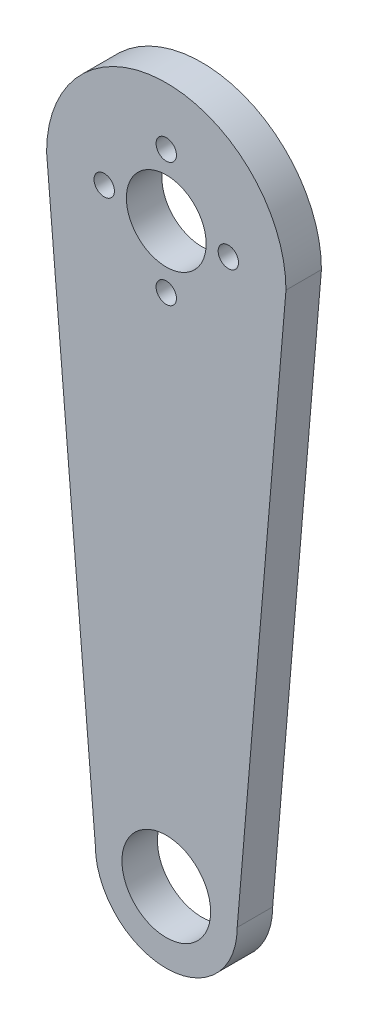
ISO-10303-21;
HEADER;
FILE_DESCRIPTION(('STEP AP214'),'2;1');
FILE_NAME('part.step','',(''),(''),'','','');
FILE_SCHEMA(('AUTOMOTIVE_DESIGN { 1 0 10303 214 1 1 1 1 }'));
ENDSEC;
DATA;
#1=APPLICATION_CONTEXT('core data for automotive mechanical design processes');
#2=APPLICATION_PROTOCOL_DEFINITION('international standard','automotive_design',2000,#1);
#3=PRODUCT_CONTEXT('',#1,'mechanical');
#4=PRODUCT('Part','Part','',(#3));
#5=PRODUCT_RELATED_PRODUCT_CATEGORY('part','',(#4));
#6=PRODUCT_DEFINITION_FORMATION('','',#4);
#7=PRODUCT_DEFINITION_CONTEXT('part definition',#1,'design');
#8=PRODUCT_DEFINITION('design','',#6,#7);
#9=PRODUCT_DEFINITION_SHAPE('','',#8);
#10=(LENGTH_UNIT() NAMED_UNIT(*) SI_UNIT(.MILLI.,.METRE.));
#11=(NAMED_UNIT(*) PLANE_ANGLE_UNIT() SI_UNIT($,.RADIAN.));
#12=(NAMED_UNIT(*) SI_UNIT($,.STERADIAN.) SOLID_ANGLE_UNIT());
#13=UNCERTAINTY_MEASURE_WITH_UNIT(LENGTH_MEASURE(1.E-05),#10,'distance_accuracy_value','');
#14=(GEOMETRIC_REPRESENTATION_CONTEXT(3) GLOBAL_UNCERTAINTY_ASSIGNED_CONTEXT((#13)) GLOBAL_UNIT_ASSIGNED_CONTEXT((#10,
#11,#12)) REPRESENTATION_CONTEXT('',''));
#15=CARTESIAN_POINT('',(0.,0.,0.));
#16=DIRECTION('',(0.,0.,1.));
#17=DIRECTION('',(1.,0.,0.));
#18=AXIS2_PLACEMENT_3D('',#15,#16,#17);
#19=CARTESIAN_POINT('',(0.,0.,4.));
#20=DIRECTION('',(0.,0.,1.));
#21=DIRECTION('',(1.,0.,0.));
#22=AXIS2_PLACEMENT_3D('',#19,#20,#21);
#23=PLANE('',#22);
#24=CARTESIAN_POINT('',(-7.,0.,4.));
#25=DIRECTION('',(0.,0.,1.));
#26=DIRECTION('',(1.,0.,0.));
#27=AXIS2_PLACEMENT_3D('',#24,#25,#26);
#28=CIRCLE('',#27,1.15);
#29=CARTESIAN_POINT('',(-5.85,0.,4.));
#30=VERTEX_POINT('',#29);
#31=EDGE_CURVE('E181',#30,#30,#28,.T.);
#32=ORIENTED_EDGE('',*,*,#31,.F.);
#33=EDGE_LOOP('',(#32));
#34=FACE_BOUND('',#33,.T.);
#35=CARTESIAN_POINT('',(7.,0.,4.));
#36=DIRECTION('',(0.,0.,1.));
#37=DIRECTION('',(1.,0.,0.));
#38=AXIS2_PLACEMENT_3D('',#35,#36,#37);
#39=CIRCLE('',#38,1.15);
#40=CARTESIAN_POINT('',(8.15,0.,4.));
#41=VERTEX_POINT('',#40);
#42=EDGE_CURVE('E138',#41,#41,#39,.T.);
#43=ORIENTED_EDGE('',*,*,#42,.F.);
#44=EDGE_LOOP('',(#43));
#45=FACE_BOUND('',#44,.T.);
#46=CARTESIAN_POINT('',(0.,0.,4.));
#47=DIRECTION('',(0.,0.,1.));
#48=DIRECTION('',(1.,0.,0.));
#49=AXIS2_PLACEMENT_3D('',#46,#47,#48);
#50=CIRCLE('',#49,4.5);
#51=CARTESIAN_POINT('',(4.5,0.,4.));
#52=VERTEX_POINT('',#51);
#53=EDGE_CURVE('E139',#52,#52,#50,.T.);
#54=ORIENTED_EDGE('',*,*,#53,.F.);
#55=EDGE_LOOP('',(#54));
#56=FACE_BOUND('',#55,.T.);
#57=CARTESIAN_POINT('',(0.,0.,4.));
#58=DIRECTION('',(0.,0.,1.));
#59=DIRECTION('',(1.,0.,0.));
#60=AXIS2_PLACEMENT_3D('',#57,#58,#59);
#61=CIRCLE('',#60,13.5);
#62=CARTESIAN_POINT('',(13.5,0.,4.));
#63=VERTEX_POINT('',#62);
#64=CARTESIAN_POINT('',(-13.5,0.,4.));
#65=VERTEX_POINT('',#64);
#66=EDGE_CURVE('E99',#63,#65,#61,.T.);
#67=ORIENTED_EDGE('',*,*,#66,.T.);
#68=DIRECTION('',(0.0843140884969095,-0.996439227690749,0.));
#69=VECTOR('',#68,1.);
#70=CARTESIAN_POINT('',(-13.5,0.,4.));
#71=LINE('',#70,#69);
#72=CARTESIAN_POINT('',(-8.,-65.,4.));
#73=VERTEX_POINT('',#72);
#74=EDGE_CURVE('E94',#65,#73,#71,.T.);
#75=ORIENTED_EDGE('',*,*,#74,.T.);
#76=CARTESIAN_POINT('',(0.,-65.,4.));
#77=DIRECTION('',(0.,0.,1.));
#78=DIRECTION('',(1.,0.,0.));
#79=AXIS2_PLACEMENT_3D('',#76,#77,#78);
#80=CIRCLE('',#79,8.);
#81=CARTESIAN_POINT('',(8.,-65.,4.));
#82=VERTEX_POINT('',#81);
#83=EDGE_CURVE('E97',#73,#82,#80,.T.);
#84=ORIENTED_EDGE('',*,*,#83,.T.);
#85=DIRECTION('',(0.0843140884969095,0.996439227690749,0.));
#86=VECTOR('',#85,1.);
#87=CARTESIAN_POINT('',(8.,-65.,4.));
#88=LINE('',#87,#86);
#89=EDGE_CURVE('E64',#82,#63,#88,.T.);
#90=ORIENTED_EDGE('',*,*,#89,.T.);
#91=EDGE_LOOP('',(#67,#75,#84,#90));
#92=FACE_BOUND('',#91,.T.);
#93=CARTESIAN_POINT('',(0.,7.,4.));
#94=DIRECTION('',(0.,0.,1.));
#95=DIRECTION('',(1.,0.,0.));
#96=AXIS2_PLACEMENT_3D('',#93,#94,#95);
#97=CIRCLE('',#96,1.15);
#98=CARTESIAN_POINT('',(1.15,7.,4.));
#99=VERTEX_POINT('',#98);
#100=EDGE_CURVE('E125',#99,#99,#97,.T.);
#101=ORIENTED_EDGE('',*,*,#100,.F.);
#102=EDGE_LOOP('',(#101));
#103=FACE_BOUND('',#102,.T.);
#104=CARTESIAN_POINT('',(0.,-7.,4.));
#105=DIRECTION('',(0.,0.,1.));
#106=DIRECTION('',(1.,0.,0.));
#107=AXIS2_PLACEMENT_3D('',#104,#105,#106);
#108=CIRCLE('',#107,1.15);
#109=CARTESIAN_POINT('',(1.15,-7.,4.));
#110=VERTEX_POINT('',#109);
#111=EDGE_CURVE('E175',#110,#110,#108,.T.);
#112=ORIENTED_EDGE('',*,*,#111,.F.);
#113=EDGE_LOOP('',(#112));
#114=FACE_BOUND('',#113,.T.);
#115=CARTESIAN_POINT('',(0.,-65.,4.));
#116=DIRECTION('',(0.,0.,1.));
#117=DIRECTION('',(1.,0.,0.));
#118=AXIS2_PLACEMENT_3D('',#115,#116,#117);
#119=CIRCLE('',#118,5.);
#120=CARTESIAN_POINT('',(5.,-65.,4.));
#121=VERTEX_POINT('',#120);
#122=EDGE_CURVE('E189',#121,#121,#119,.T.);
#123=ORIENTED_EDGE('',*,*,#122,.F.);
#124=EDGE_LOOP('',(#123));
#125=FACE_BOUND('',#124,.T.);
#126=ADVANCED_FACE('F46',(#34,#45,#56,#92,#103,#114,#125),#23,.T.);
#127=CARTESIAN_POINT('',(0.,0.,0.));
#128=DIRECTION('',(0.,0.,1.));
#129=DIRECTION('',(1.,0.,0.));
#130=AXIS2_PLACEMENT_3D('',#127,#128,#129);
#131=PLANE('',#130);
#132=CARTESIAN_POINT('',(0.,0.,0.));
#133=DIRECTION('',(0.,0.,1.));
#134=DIRECTION('',(1.,0.,0.));
#135=AXIS2_PLACEMENT_3D('',#132,#133,#134);
#136=CIRCLE('',#135,13.5);
#137=CARTESIAN_POINT('',(13.5,0.,0.));
#138=VERTEX_POINT('',#137);
#139=CARTESIAN_POINT('',(-13.5,0.,0.));
#140=VERTEX_POINT('',#139);
#141=EDGE_CURVE('E144',#138,#140,#136,.T.);
#142=ORIENTED_EDGE('',*,*,#141,.F.);
#143=DIRECTION('',(0.0843140884969095,0.996439227690749,0.));
#144=VECTOR('',#143,1.);
#145=CARTESIAN_POINT('',(8.,-65.,0.));
#146=LINE('',#145,#144);
#147=CARTESIAN_POINT('',(8.,-65.,0.));
#148=VERTEX_POINT('',#147);
#149=EDGE_CURVE('E87',#148,#138,#146,.T.);
#150=ORIENTED_EDGE('',*,*,#149,.F.);
#151=CARTESIAN_POINT('',(0.,-65.,0.));
#152=DIRECTION('',(0.,0.,1.));
#153=DIRECTION('',(1.,0.,0.));
#154=AXIS2_PLACEMENT_3D('',#151,#152,#153);
#155=CIRCLE('',#154,8.);
#156=CARTESIAN_POINT('',(-8.,-65.,0.));
#157=VERTEX_POINT('',#156);
#158=EDGE_CURVE('E81',#157,#148,#155,.T.);
#159=ORIENTED_EDGE('',*,*,#158,.F.);
#160=DIRECTION('',(0.0843140884969095,-0.996439227690749,0.));
#161=VECTOR('',#160,1.);
#162=CARTESIAN_POINT('',(-13.5,0.,0.));
#163=LINE('',#162,#161);
#164=EDGE_CURVE('E104',#140,#157,#163,.T.);
#165=ORIENTED_EDGE('',*,*,#164,.F.);
#166=EDGE_LOOP('',(#142,#150,#159,#165));
#167=FACE_BOUND('',#166,.T.);
#168=CARTESIAN_POINT('',(0.,0.,0.));
#169=DIRECTION('',(0.,0.,1.));
#170=DIRECTION('',(1.,0.,0.));
#171=AXIS2_PLACEMENT_3D('',#168,#169,#170);
#172=CIRCLE('',#171,4.5);
#173=CARTESIAN_POINT('',(4.5,0.,0.));
#174=VERTEX_POINT('',#173);
#175=EDGE_CURVE('E131',#174,#174,#172,.T.);
#176=ORIENTED_EDGE('',*,*,#175,.T.);
#177=EDGE_LOOP('',(#176));
#178=FACE_BOUND('',#177,.T.);
#179=CARTESIAN_POINT('',(0.,7.,0.));
#180=DIRECTION('',(0.,0.,1.));
#181=DIRECTION('',(1.,0.,0.));
#182=AXIS2_PLACEMENT_3D('',#179,#180,#181);
#183=CIRCLE('',#182,1.15);
#184=CARTESIAN_POINT('',(1.15,7.,0.));
#185=VERTEX_POINT('',#184);
#186=EDGE_CURVE('E132',#185,#185,#183,.T.);
#187=ORIENTED_EDGE('',*,*,#186,.T.);
#188=EDGE_LOOP('',(#187));
#189=FACE_BOUND('',#188,.T.);
#190=CARTESIAN_POINT('',(7.,0.,0.));
#191=DIRECTION('',(0.,0.,1.));
#192=DIRECTION('',(1.,0.,0.));
#193=AXIS2_PLACEMENT_3D('',#190,#191,#192);
#194=CIRCLE('',#193,1.15);
#195=CARTESIAN_POINT('',(8.15,0.,0.));
#196=VERTEX_POINT('',#195);
#197=EDGE_CURVE('E133',#196,#196,#194,.T.);
#198=ORIENTED_EDGE('',*,*,#197,.T.);
#199=EDGE_LOOP('',(#198));
#200=FACE_BOUND('',#199,.T.);
#201=CARTESIAN_POINT('',(0.,-7.,0.));
#202=DIRECTION('',(0.,0.,1.));
#203=DIRECTION('',(1.,0.,0.));
#204=AXIS2_PLACEMENT_3D('',#201,#202,#203);
#205=CIRCLE('',#204,1.15);
#206=CARTESIAN_POINT('',(1.15,-7.,0.));
#207=VERTEX_POINT('',#206);
#208=EDGE_CURVE('E178',#207,#207,#205,.T.);
#209=ORIENTED_EDGE('',*,*,#208,.T.);
#210=EDGE_LOOP('',(#209));
#211=FACE_BOUND('',#210,.T.);
#212=CARTESIAN_POINT('',(-7.,0.,0.));
#213=DIRECTION('',(0.,0.,1.));
#214=DIRECTION('',(1.,0.,0.));
#215=AXIS2_PLACEMENT_3D('',#212,#213,#214);
#216=CIRCLE('',#215,1.15);
#217=CARTESIAN_POINT('',(-5.85,0.,0.));
#218=VERTEX_POINT('',#217);
#219=EDGE_CURVE('E185',#218,#218,#216,.T.);
#220=ORIENTED_EDGE('',*,*,#219,.T.);
#221=EDGE_LOOP('',(#220));
#222=FACE_BOUND('',#221,.T.);
#223=CARTESIAN_POINT('',(0.,-65.,0.));
#224=DIRECTION('',(0.,0.,1.));
#225=DIRECTION('',(1.,0.,0.));
#226=AXIS2_PLACEMENT_3D('',#223,#224,#225);
#227=CIRCLE('',#226,5.);
#228=CARTESIAN_POINT('',(5.,-65.,0.));
#229=VERTEX_POINT('',#228);
#230=EDGE_CURVE('E193',#229,#229,#227,.T.);
#231=ORIENTED_EDGE('',*,*,#230,.T.);
#232=EDGE_LOOP('',(#231));
#233=FACE_BOUND('',#232,.T.);
#234=ADVANCED_FACE('F162',(#167,#178,#189,#200,#211,#222,#233),#131,.F.);
#235=CARTESIAN_POINT('',(0.,0.,4.));
#236=DIRECTION('',(0.,0.,-1.));
#237=DIRECTION('',(-1.,0.,0.));
#238=AXIS2_PLACEMENT_3D('',#235,#236,#237);
#239=CYLINDRICAL_SURFACE('',#238,13.5);
#240=ORIENTED_EDGE('',*,*,#141,.T.);
#241=DIRECTION('',(0.,0.,-1.));
#242=VECTOR('',#241,1.);
#243=CARTESIAN_POINT('',(-13.5,0.,4.));
#244=LINE('',#243,#242);
#245=EDGE_CURVE('E12',#65,#140,#244,.T.);
#246=ORIENTED_EDGE('',*,*,#245,.F.);
#247=ORIENTED_EDGE('',*,*,#66,.F.);
#248=DIRECTION('',(0.,0.,-1.));
#249=VECTOR('',#248,1.);
#250=CARTESIAN_POINT('',(13.5,0.,4.));
#251=LINE('',#250,#249);
#252=EDGE_CURVE('E111',#63,#138,#251,.T.);
#253=ORIENTED_EDGE('',*,*,#252,.T.);
#254=EDGE_LOOP('',(#240,#246,#247,#253));
#255=FACE_BOUND('',#254,.T.);
#256=ADVANCED_FACE('F48',(#255),#239,.T.);
#257=CARTESIAN_POINT('',(-13.5,0.,4.));
#258=DIRECTION('',(0.996439227690748,0.0843140884969095,0.));
#259=DIRECTION('',(-0.0843140884969095,0.996439227690749,0.));
#260=AXIS2_PLACEMENT_3D('',#257,#258,#259);
#261=PLANE('',#260);
#262=ORIENTED_EDGE('',*,*,#164,.T.);
#263=DIRECTION('',(0.,0.,-1.));
#264=VECTOR('',#263,1.);
#265=CARTESIAN_POINT('',(-8.,-65.,4.));
#266=LINE('',#265,#264);
#267=EDGE_CURVE('E56',#73,#157,#266,.T.);
#268=ORIENTED_EDGE('',*,*,#267,.F.);
#269=ORIENTED_EDGE('',*,*,#74,.F.);
#270=ORIENTED_EDGE('',*,*,#245,.T.);
#271=EDGE_LOOP('',(#262,#268,#269,#270));
#272=FACE_BOUND('',#271,.T.);
#273=ADVANCED_FACE('F103',(#272),#261,.F.);
#274=CARTESIAN_POINT('',(0.,-65.,4.));
#275=DIRECTION('',(0.,0.,-1.));
#276=DIRECTION('',(-1.,0.,0.));
#277=AXIS2_PLACEMENT_3D('',#274,#275,#276);
#278=CYLINDRICAL_SURFACE('',#277,8.);
#279=ORIENTED_EDGE('',*,*,#158,.T.);
#280=DIRECTION('',(0.,0.,-1.));
#281=VECTOR('',#280,1.);
#282=CARTESIAN_POINT('',(8.,-65.,4.));
#283=LINE('',#282,#281);
#284=EDGE_CURVE('E106',#82,#148,#283,.T.);
#285=ORIENTED_EDGE('',*,*,#284,.F.);
#286=ORIENTED_EDGE('',*,*,#83,.F.);
#287=ORIENTED_EDGE('',*,*,#267,.T.);
#288=EDGE_LOOP('',(#279,#285,#286,#287));
#289=FACE_BOUND('',#288,.T.);
#290=ADVANCED_FACE('F107',(#289),#278,.T.);
#291=CARTESIAN_POINT('',(8.,-65.,4.));
#292=DIRECTION('',(-0.996439227690748,0.0843140884969095,0.));
#293=DIRECTION('',(-0.0843140884969095,-0.996439227690749,0.));
#294=AXIS2_PLACEMENT_3D('',#291,#292,#293);
#295=PLANE('',#294);
#296=ORIENTED_EDGE('',*,*,#149,.T.);
#297=ORIENTED_EDGE('',*,*,#252,.F.);
#298=ORIENTED_EDGE('',*,*,#89,.F.);
#299=ORIENTED_EDGE('',*,*,#284,.T.);
#300=EDGE_LOOP('',(#296,#297,#298,#299));
#301=FACE_BOUND('',#300,.T.);
#302=ADVANCED_FACE('F159',(#301),#295,.F.);
#303=CARTESIAN_POINT('',(0.,0.,4.));
#304=DIRECTION('',(0.,0.,-1.));
#305=DIRECTION('',(-1.,0.,0.));
#306=AXIS2_PLACEMENT_3D('',#303,#304,#305);
#307=CYLINDRICAL_SURFACE('',#306,4.5);
#308=ORIENTED_EDGE('',*,*,#53,.T.);
#309=EDGE_LOOP('',(#308));
#310=FACE_BOUND('',#309,.T.);
#311=ORIENTED_EDGE('',*,*,#175,.F.);
#312=EDGE_LOOP('',(#311));
#313=FACE_BOUND('',#312,.T.);
#314=ADVANCED_FACE('F224',(#310,#313),#307,.F.);
#315=CARTESIAN_POINT('',(0.,7.,4.));
#316=DIRECTION('',(0.,0.,-1.));
#317=DIRECTION('',(-1.,0.,0.));
#318=AXIS2_PLACEMENT_3D('',#315,#316,#317);
#319=CYLINDRICAL_SURFACE('',#318,1.15);
#320=ORIENTED_EDGE('',*,*,#100,.T.);
#321=EDGE_LOOP('',(#320));
#322=FACE_BOUND('',#321,.T.);
#323=ORIENTED_EDGE('',*,*,#186,.F.);
#324=EDGE_LOOP('',(#323));
#325=FACE_BOUND('',#324,.T.);
#326=ADVANCED_FACE('F269',(#322,#325),#319,.F.);
#327=CARTESIAN_POINT('',(7.,0.,4.));
#328=DIRECTION('',(0.,0.,-1.));
#329=DIRECTION('',(-1.,0.,0.));
#330=AXIS2_PLACEMENT_3D('',#327,#328,#329);
#331=CYLINDRICAL_SURFACE('',#330,1.15);
#332=ORIENTED_EDGE('',*,*,#42,.T.);
#333=EDGE_LOOP('',(#332));
#334=FACE_BOUND('',#333,.T.);
#335=ORIENTED_EDGE('',*,*,#197,.F.);
#336=EDGE_LOOP('',(#335));
#337=FACE_BOUND('',#336,.T.);
#338=ADVANCED_FACE('F277',(#334,#337),#331,.F.);
#339=CARTESIAN_POINT('',(0.,-7.,4.));
#340=DIRECTION('',(0.,0.,-1.));
#341=DIRECTION('',(-1.,0.,0.));
#342=AXIS2_PLACEMENT_3D('',#339,#340,#341);
#343=CYLINDRICAL_SURFACE('',#342,1.15);
#344=ORIENTED_EDGE('',*,*,#111,.T.);
#345=EDGE_LOOP('',(#344));
#346=FACE_BOUND('',#345,.T.);
#347=ORIENTED_EDGE('',*,*,#208,.F.);
#348=EDGE_LOOP('',(#347));
#349=FACE_BOUND('',#348,.T.);
#350=ADVANCED_FACE('F211',(#346,#349),#343,.F.);
#351=CARTESIAN_POINT('',(-7.,0.,4.));
#352=DIRECTION('',(0.,0.,-1.));
#353=DIRECTION('',(-1.,0.,0.));
#354=AXIS2_PLACEMENT_3D('',#351,#352,#353);
#355=CYLINDRICAL_SURFACE('',#354,1.15);
#356=ORIENTED_EDGE('',*,*,#31,.T.);
#357=EDGE_LOOP('',(#356));
#358=FACE_BOUND('',#357,.T.);
#359=ORIENTED_EDGE('',*,*,#219,.F.);
#360=EDGE_LOOP('',(#359));
#361=FACE_BOUND('',#360,.T.);
#362=ADVANCED_FACE('F205',(#358,#361),#355,.F.);
#363=CARTESIAN_POINT('',(0.,-65.,4.));
#364=DIRECTION('',(0.,0.,-1.));
#365=DIRECTION('',(-1.,0.,0.));
#366=AXIS2_PLACEMENT_3D('',#363,#364,#365);
#367=CYLINDRICAL_SURFACE('',#366,5.);
#368=ORIENTED_EDGE('',*,*,#122,.T.);
#369=EDGE_LOOP('',(#368));
#370=FACE_BOUND('',#369,.T.);
#371=ORIENTED_EDGE('',*,*,#230,.F.);
#372=EDGE_LOOP('',(#371));
#373=FACE_BOUND('',#372,.T.);
#374=ADVANCED_FACE('F203',(#370,#373),#367,.F.);
#375=CLOSED_SHELL('',(#126,#234,#256,#273,#290,#302,#314,#326,#338,#350,#362,#374));
#376=MANIFOLD_SOLID_BREP('B2',#375);
#377=ADVANCED_BREP_SHAPE_REPRESENTATION('',(#18,#376),#14);
#378=SHAPE_DEFINITION_REPRESENTATION(#9,#377);
ENDSEC;
END-ISO-10303-21;
